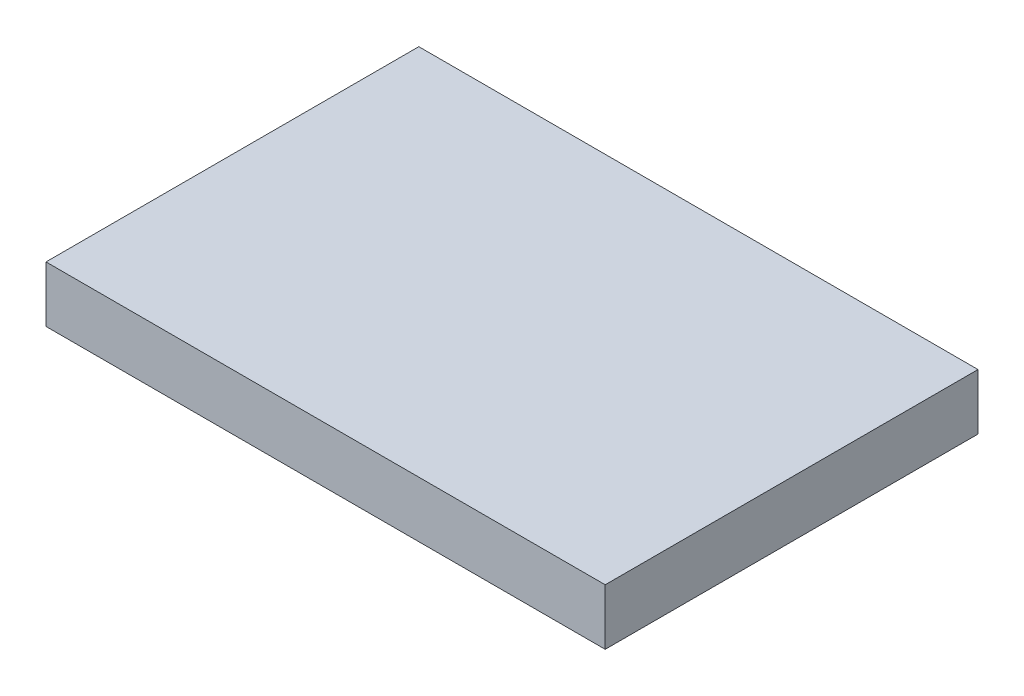
ISO-10303-21;
HEADER;
FILE_DESCRIPTION(('STEP AP214'),'2;1');
FILE_NAME('part.step','',(''),(''),'','','');
FILE_SCHEMA(('AUTOMOTIVE_DESIGN { 1 0 10303 214 1 1 1 1 }'));
ENDSEC;
DATA;
#1=APPLICATION_CONTEXT('core data for automotive mechanical design processes');
#2=APPLICATION_PROTOCOL_DEFINITION('international standard','automotive_design',2000,#1);
#3=PRODUCT_CONTEXT('',#1,'mechanical');
#4=PRODUCT('Part','Part','',(#3));
#5=PRODUCT_RELATED_PRODUCT_CATEGORY('part','',(#4));
#6=PRODUCT_DEFINITION_FORMATION('','',#4);
#7=PRODUCT_DEFINITION_CONTEXT('part definition',#1,'design');
#8=PRODUCT_DEFINITION('design','',#6,#7);
#9=PRODUCT_DEFINITION_SHAPE('','',#8);
#10=(LENGTH_UNIT() NAMED_UNIT(*) SI_UNIT(.MILLI.,.METRE.));
#11=(NAMED_UNIT(*) PLANE_ANGLE_UNIT() SI_UNIT($,.RADIAN.));
#12=(NAMED_UNIT(*) SI_UNIT($,.STERADIAN.) SOLID_ANGLE_UNIT());
#13=UNCERTAINTY_MEASURE_WITH_UNIT(LENGTH_MEASURE(1.E-05),#10,'distance_accuracy_value','');
#14=(GEOMETRIC_REPRESENTATION_CONTEXT(3) GLOBAL_UNCERTAINTY_ASSIGNED_CONTEXT((#13)) GLOBAL_UNIT_ASSIGNED_CONTEXT((#10,
#11,#12)) REPRESENTATION_CONTEXT('',''));
#15=CARTESIAN_POINT('',(0.,0.,0.));
#16=DIRECTION('',(0.,0.,1.));
#17=DIRECTION('',(1.,0.,0.));
#18=AXIS2_PLACEMENT_3D('',#15,#16,#17);
#19=CARTESIAN_POINT('',(0.,3.,0.));
#20=DIRECTION('',(-1.,0.,0.));
#21=DIRECTION('',(0.,0.,1.));
#22=AXIS2_PLACEMENT_3D('',#19,#20,#21);
#23=PLANE('',#22);
#24=DIRECTION('',(0.,0.,-1.));
#25=VECTOR('',#24,1.);
#26=CARTESIAN_POINT('',(0.,0.,0.));
#27=LINE('',#26,#25);
#28=CARTESIAN_POINT('',(0.,0.,0.));
#29=VERTEX_POINT('',#28);
#30=CARTESIAN_POINT('',(0.,0.,-20.));
#31=VERTEX_POINT('',#30);
#32=EDGE_CURVE('E104',#29,#31,#27,.T.);
#33=ORIENTED_EDGE('',*,*,#32,.F.);
#34=DIRECTION('',(0.,-1.,0.));
#35=VECTOR('',#34,1.);
#36=CARTESIAN_POINT('',(0.,3.,0.));
#37=LINE('',#36,#35);
#38=CARTESIAN_POINT('',(0.,3.,0.));
#39=VERTEX_POINT('',#38);
#40=EDGE_CURVE('E11',#39,#29,#37,.T.);
#41=ORIENTED_EDGE('',*,*,#40,.F.);
#42=DIRECTION('',(0.,0.,-1.));
#43=VECTOR('',#42,1.);
#44=CARTESIAN_POINT('',(0.,3.,0.));
#45=LINE('',#44,#43);
#46=CARTESIAN_POINT('',(0.,3.,-20.));
#47=VERTEX_POINT('',#46);
#48=EDGE_CURVE('E99',#39,#47,#45,.T.);
#49=ORIENTED_EDGE('',*,*,#48,.T.);
#50=DIRECTION('',(0.,-1.,0.));
#51=VECTOR('',#50,1.);
#52=CARTESIAN_POINT('',(0.,3.,-20.));
#53=LINE('',#52,#51);
#54=EDGE_CURVE('E42',#47,#31,#53,.T.);
#55=ORIENTED_EDGE('',*,*,#54,.T.);
#56=EDGE_LOOP('',(#33,#41,#49,#55));
#57=FACE_BOUND('',#56,.T.);
#58=ADVANCED_FACE('F39',(#57),#23,.T.);
#59=CARTESIAN_POINT('',(0.,3.,0.));
#60=DIRECTION('',(0.,0.,-1.));
#61=DIRECTION('',(-1.,0.,0.));
#62=AXIS2_PLACEMENT_3D('',#59,#60,#61);
#63=PLANE('',#62);
#64=DIRECTION('',(1.,0.,0.));
#65=VECTOR('',#64,1.);
#66=CARTESIAN_POINT('',(0.,0.,0.));
#67=LINE('',#66,#65);
#68=CARTESIAN_POINT('',(30.,0.,0.));
#69=VERTEX_POINT('',#68);
#70=EDGE_CURVE('E72',#29,#69,#67,.T.);
#71=ORIENTED_EDGE('',*,*,#70,.T.);
#72=DIRECTION('',(0.,-1.,0.));
#73=VECTOR('',#72,1.);
#74=CARTESIAN_POINT('',(30.,3.,0.));
#75=LINE('',#74,#73);
#76=CARTESIAN_POINT('',(30.,3.,0.));
#77=VERTEX_POINT('',#76);
#78=EDGE_CURVE('E48',#77,#69,#75,.T.);
#79=ORIENTED_EDGE('',*,*,#78,.F.);
#80=DIRECTION('',(1.,0.,0.));
#81=VECTOR('',#80,1.);
#82=CARTESIAN_POINT('',(0.,3.,0.));
#83=LINE('',#82,#81);
#84=EDGE_CURVE('E89',#39,#77,#83,.T.);
#85=ORIENTED_EDGE('',*,*,#84,.F.);
#86=ORIENTED_EDGE('',*,*,#40,.T.);
#87=EDGE_LOOP('',(#71,#79,#85,#86));
#88=FACE_BOUND('',#87,.T.);
#89=ADVANCED_FACE('F114',(#88),#63,.F.);
#90=CARTESIAN_POINT('',(30.,3.,0.));
#91=DIRECTION('',(-1.,0.,0.));
#92=DIRECTION('',(0.,0.,1.));
#93=AXIS2_PLACEMENT_3D('',#90,#91,#92);
#94=PLANE('',#93);
#95=DIRECTION('',(0.,0.,-1.));
#96=VECTOR('',#95,1.);
#97=CARTESIAN_POINT('',(30.,0.,0.));
#98=LINE('',#97,#96);
#99=CARTESIAN_POINT('',(30.,0.,-20.));
#100=VERTEX_POINT('',#99);
#101=EDGE_CURVE('E96',#69,#100,#98,.T.);
#102=ORIENTED_EDGE('',*,*,#101,.T.);
#103=DIRECTION('',(0.,-1.,0.));
#104=VECTOR('',#103,1.);
#105=CARTESIAN_POINT('',(30.,3.,-20.));
#106=LINE('',#105,#104);
#107=CARTESIAN_POINT('',(30.,3.,-20.));
#108=VERTEX_POINT('',#107);
#109=EDGE_CURVE('E93',#108,#100,#106,.T.);
#110=ORIENTED_EDGE('',*,*,#109,.F.);
#111=DIRECTION('',(0.,0.,-1.));
#112=VECTOR('',#111,1.);
#113=CARTESIAN_POINT('',(30.,3.,0.));
#114=LINE('',#113,#112);
#115=EDGE_CURVE('E84',#77,#108,#114,.T.);
#116=ORIENTED_EDGE('',*,*,#115,.F.);
#117=ORIENTED_EDGE('',*,*,#78,.T.);
#118=EDGE_LOOP('',(#102,#110,#116,#117));
#119=FACE_BOUND('',#118,.T.);
#120=ADVANCED_FACE('F94',(#119),#94,.F.);
#121=CARTESIAN_POINT('',(0.,3.,-20.));
#122=DIRECTION('',(0.,0.,-1.));
#123=DIRECTION('',(-1.,0.,0.));
#124=AXIS2_PLACEMENT_3D('',#121,#122,#123);
#125=PLANE('',#124);
#126=DIRECTION('',(1.,0.,0.));
#127=VECTOR('',#126,1.);
#128=CARTESIAN_POINT('',(0.,0.,-20.));
#129=LINE('',#128,#127);
#130=EDGE_CURVE('E107',#31,#100,#129,.T.);
#131=ORIENTED_EDGE('',*,*,#130,.F.);
#132=ORIENTED_EDGE('',*,*,#54,.F.);
#133=DIRECTION('',(1.,0.,0.));
#134=VECTOR('',#133,1.);
#135=CARTESIAN_POINT('',(0.,3.,-20.));
#136=LINE('',#135,#134);
#137=EDGE_CURVE('E88',#47,#108,#136,.T.);
#138=ORIENTED_EDGE('',*,*,#137,.T.);
#139=ORIENTED_EDGE('',*,*,#109,.T.);
#140=EDGE_LOOP('',(#131,#132,#138,#139));
#141=FACE_BOUND('',#140,.T.);
#142=ADVANCED_FACE('F98',(#141),#125,.T.);
#143=CARTESIAN_POINT('',(0.,3.,0.));
#144=DIRECTION('',(0.,-1.,0.));
#145=DIRECTION('',(0.,0.,-1.));
#146=AXIS2_PLACEMENT_3D('',#143,#144,#145);
#147=PLANE('',#146);
#148=ORIENTED_EDGE('',*,*,#48,.F.);
#149=ORIENTED_EDGE('',*,*,#84,.T.);
#150=ORIENTED_EDGE('',*,*,#115,.T.);
#151=ORIENTED_EDGE('',*,*,#137,.F.);
#152=EDGE_LOOP('',(#148,#149,#150,#151));
#153=FACE_BOUND('',#152,.T.);
#154=ADVANCED_FACE('F87',(#153),#147,.F.);
#155=CARTESIAN_POINT('',(0.,0.,0.));
#156=DIRECTION('',(0.,-1.,0.));
#157=DIRECTION('',(0.,0.,-1.));
#158=AXIS2_PLACEMENT_3D('',#155,#156,#157);
#159=PLANE('',#158);
#160=ORIENTED_EDGE('',*,*,#32,.T.);
#161=ORIENTED_EDGE('',*,*,#130,.T.);
#162=ORIENTED_EDGE('',*,*,#101,.F.);
#163=ORIENTED_EDGE('',*,*,#70,.F.);
#164=EDGE_LOOP('',(#160,#161,#162,#163));
#165=FACE_BOUND('',#164,.T.);
#166=ADVANCED_FACE('F112',(#165),#159,.T.);
#167=CLOSED_SHELL('',(#58,#89,#120,#142,#154,#166));
#168=MANIFOLD_SOLID_BREP('B2',#167);
#169=ADVANCED_BREP_SHAPE_REPRESENTATION('',(#18,#168),#14);
#170=SHAPE_DEFINITION_REPRESENTATION(#9,#169);
ENDSEC;
END-ISO-10303-21;
